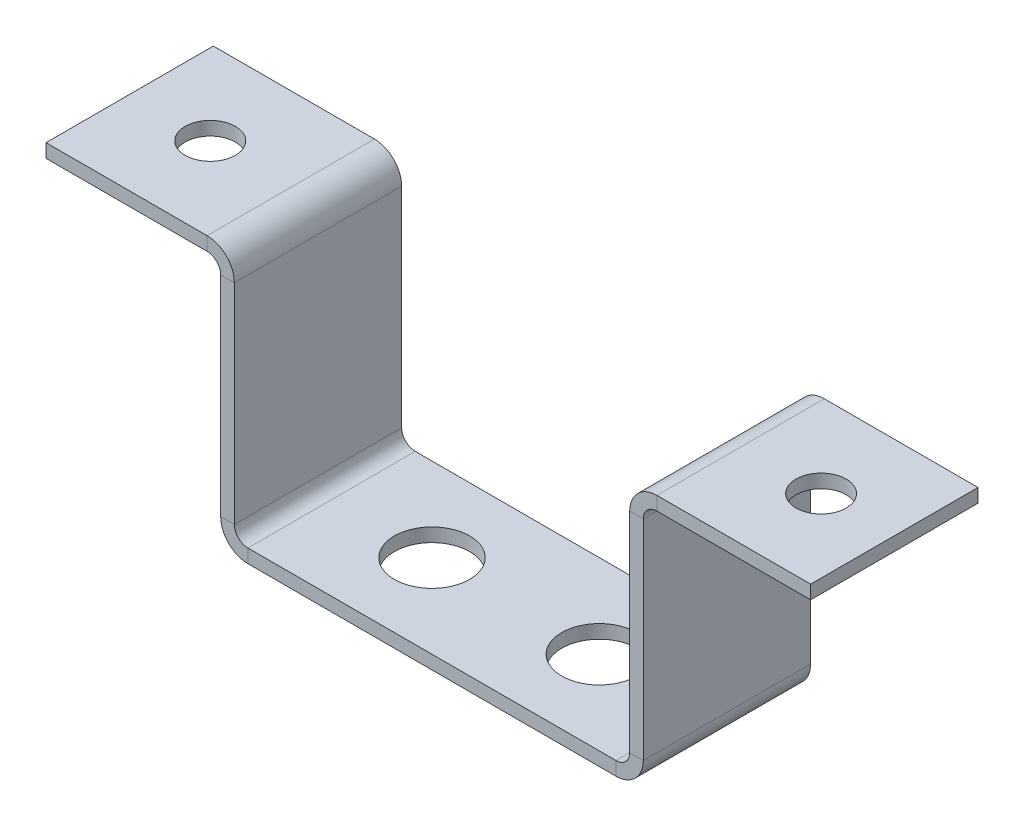
ISO-10303-21;
HEADER;
FILE_DESCRIPTION(('STEP AP214'),'2;1');
FILE_NAME('part.step','',(''),(''),'','','');
FILE_SCHEMA(('AUTOMOTIVE_DESIGN { 1 0 10303 214 1 1 1 1 }'));
ENDSEC;
DATA;
#1=APPLICATION_CONTEXT('core data for automotive mechanical design processes');
#2=APPLICATION_PROTOCOL_DEFINITION('international standard','automotive_design',2000,#1);
#3=PRODUCT_CONTEXT('',#1,'mechanical');
#4=PRODUCT('Part','Part','',(#3));
#5=PRODUCT_RELATED_PRODUCT_CATEGORY('part','',(#4));
#6=PRODUCT_DEFINITION_FORMATION('','',#4);
#7=PRODUCT_DEFINITION_CONTEXT('part definition',#1,'design');
#8=PRODUCT_DEFINITION('design','',#6,#7);
#9=PRODUCT_DEFINITION_SHAPE('','',#8);
#10=(LENGTH_UNIT() NAMED_UNIT(*) SI_UNIT(.MILLI.,.METRE.));
#11=(NAMED_UNIT(*) PLANE_ANGLE_UNIT() SI_UNIT($,.RADIAN.));
#12=(NAMED_UNIT(*) SI_UNIT($,.STERADIAN.) SOLID_ANGLE_UNIT());
#13=UNCERTAINTY_MEASURE_WITH_UNIT(LENGTH_MEASURE(1.E-05),#10,'distance_accuracy_value','');
#14=(GEOMETRIC_REPRESENTATION_CONTEXT(3) GLOBAL_UNCERTAINTY_ASSIGNED_CONTEXT((#13)) GLOBAL_UNIT_ASSIGNED_CONTEXT((#10,
#11,#12)) REPRESENTATION_CONTEXT('',''));
#15=CARTESIAN_POINT('',(0.,0.,0.));
#16=DIRECTION('',(0.,0.,1.));
#17=DIRECTION('',(1.,0.,0.));
#18=AXIS2_PLACEMENT_3D('',#15,#16,#17);
#19=CARTESIAN_POINT('',(23.6256,0.812799999999997,0.));
#20=DIRECTION('',(0.,0.,-1.));
#21=DIRECTION('',(-1.,0.,0.));
#22=AXIS2_PLACEMENT_3D('',#19,#20,#21);
#23=PLANE('',#22);
#24=DIRECTION('',(-1.,0.,0.));
#25=VECTOR('',#24,1.);
#26=CARTESIAN_POINT('',(23.6256,14.13,0.));
#27=LINE('',#26,#25);
#28=CARTESIAN_POINT('',(23.6256,14.13,0.));
#29=VERTEX_POINT('',#28);
#30=CARTESIAN_POINT('',(22.8128,14.13,0.));
#31=VERTEX_POINT('',#30);
#32=EDGE_CURVE('E289',#29,#31,#27,.T.);
#33=ORIENTED_EDGE('',*,*,#32,.T.);
#34=DIRECTION('',(0.,1.,0.));
#35=VECTOR('',#34,1.);
#36=CARTESIAN_POINT('',(22.8128,0.8128,0.));
#37=LINE('',#36,#35);
#38=CARTESIAN_POINT('',(22.8128,1.62559999999999,0.));
#39=VERTEX_POINT('',#38);
#40=EDGE_CURVE('E387',#31,#39,#37,.F.);
#41=ORIENTED_EDGE('',*,*,#40,.T.);
#42=DIRECTION('',(-1.,0.,0.));
#43=VECTOR('',#42,1.);
#44=CARTESIAN_POINT('',(23.6256,1.62559999999999,0.));
#45=LINE('',#44,#43);
#46=CARTESIAN_POINT('',(23.6256,1.62559999999999,0.));
#47=VERTEX_POINT('',#46);
#48=EDGE_CURVE('E371',#39,#47,#45,.F.);
#49=ORIENTED_EDGE('',*,*,#48,.T.);
#50=DIRECTION('',(0.,-1.,0.));
#51=VECTOR('',#50,1.);
#52=CARTESIAN_POINT('',(23.6256,0.,0.));
#53=LINE('',#52,#51);
#54=EDGE_CURVE('E380',#29,#47,#53,.T.);
#55=ORIENTED_EDGE('',*,*,#54,.F.);
#56=EDGE_LOOP('',(#33,#41,#49,#55));
#57=FACE_BOUND('',#56,.T.);
#58=ADVANCED_FACE('F87',(#57),#23,.F.);
#59=CARTESIAN_POINT('',(23.6256,14.9428,-10.));
#60=DIRECTION('',(0.,0.,1.));
#61=DIRECTION('',(0.,-1.,0.));
#62=AXIS2_PLACEMENT_3D('',#59,#60,#61);
#63=PLANE('',#62);
#64=DIRECTION('',(-1.,0.,0.));
#65=VECTOR('',#64,1.);
#66=CARTESIAN_POINT('',(23.6256,14.13,-10.));
#67=LINE('',#66,#65);
#68=CARTESIAN_POINT('',(23.6256,14.13,-10.));
#69=VERTEX_POINT('',#68);
#70=CARTESIAN_POINT('',(22.8128,14.13,-10.));
#71=VERTEX_POINT('',#70);
#72=EDGE_CURVE('E299',#69,#71,#67,.T.);
#73=ORIENTED_EDGE('',*,*,#72,.F.);
#74=DIRECTION('',(0.,1.,0.));
#75=VECTOR('',#74,1.);
#76=CARTESIAN_POINT('',(23.6256,0.,-10.));
#77=LINE('',#76,#75);
#78=CARTESIAN_POINT('',(23.6256,1.62559999999999,-10.));
#79=VERTEX_POINT('',#78);
#80=EDGE_CURVE('E375',#79,#69,#77,.T.);
#81=ORIENTED_EDGE('',*,*,#80,.F.);
#82=DIRECTION('',(-1.,0.,0.));
#83=VECTOR('',#82,1.);
#84=CARTESIAN_POINT('',(22.8128,1.62559999999999,-10.));
#85=LINE('',#84,#83);
#86=CARTESIAN_POINT('',(22.8128,1.62559999999999,-10.));
#87=VERTEX_POINT('',#86);
#88=EDGE_CURVE('E394',#87,#79,#85,.F.);
#89=ORIENTED_EDGE('',*,*,#88,.F.);
#90=DIRECTION('',(0.,-1.,0.));
#91=VECTOR('',#90,1.);
#92=CARTESIAN_POINT('',(22.8128,14.9428,-10.));
#93=LINE('',#92,#91);
#94=EDGE_CURVE('E383',#87,#71,#93,.F.);
#95=ORIENTED_EDGE('',*,*,#94,.T.);
#96=EDGE_LOOP('',(#73,#81,#89,#95));
#97=FACE_BOUND('',#96,.T.);
#98=ADVANCED_FACE('F518',(#97),#63,.F.);
#99=CARTESIAN_POINT('',(23.6256,0.,0.));
#100=DIRECTION('',(-1.,0.,0.));
#101=DIRECTION('',(0.,-1.,0.));
#102=AXIS2_PLACEMENT_3D('',#99,#100,#101);
#103=PLANE('',#102);
#104=DIRECTION('',(0.,0.,1.));
#105=VECTOR('',#104,1.);
#106=CARTESIAN_POINT('',(23.6256,14.13,0.));
#107=LINE('',#106,#105);
#108=EDGE_CURVE('E294',#29,#69,#107,.F.);
#109=ORIENTED_EDGE('',*,*,#108,.F.);
#110=ORIENTED_EDGE('',*,*,#54,.T.);
#111=DIRECTION('',(0.,0.,-1.));
#112=VECTOR('',#111,1.);
#113=CARTESIAN_POINT('',(23.6256,1.62559999999999,0.));
#114=LINE('',#113,#112);
#115=EDGE_CURVE('E390',#79,#47,#114,.F.);
#116=ORIENTED_EDGE('',*,*,#115,.F.);
#117=ORIENTED_EDGE('',*,*,#80,.T.);
#118=EDGE_LOOP('',(#109,#110,#116,#117));
#119=FACE_BOUND('',#118,.T.);
#120=ADVANCED_FACE('F513',(#119),#103,.F.);
#121=CARTESIAN_POINT('',(22.8128,0.,0.));
#122=DIRECTION('',(-1.,0.,0.));
#123=DIRECTION('',(0.,-1.,0.));
#124=AXIS2_PLACEMENT_3D('',#121,#122,#123);
#125=PLANE('',#124);
#126=ORIENTED_EDGE('',*,*,#40,.F.);
#127=DIRECTION('',(0.,0.,1.));
#128=VECTOR('',#127,1.);
#129=CARTESIAN_POINT('',(22.8128,14.13,0.));
#130=LINE('',#129,#128);
#131=EDGE_CURVE('E230',#31,#71,#130,.F.);
#132=ORIENTED_EDGE('',*,*,#131,.T.);
#133=ORIENTED_EDGE('',*,*,#94,.F.);
#134=DIRECTION('',(0.,0.,-1.));
#135=VECTOR('',#134,1.);
#136=CARTESIAN_POINT('',(22.8128,1.62559999999999,0.));
#137=LINE('',#136,#135);
#138=EDGE_CURVE('E398',#39,#87,#137,.T.);
#139=ORIENTED_EDGE('',*,*,#138,.F.);
#140=EDGE_LOOP('',(#126,#132,#133,#139));
#141=FACE_BOUND('',#140,.T.);
#142=ADVANCED_FACE('F526',(#141),#125,.T.);
#143=CARTESIAN_POINT('',(-1.62560000000005,14.9428,0.));
#144=DIRECTION('',(0.,0.,-1.));
#145=DIRECTION('',(0.,1.,0.));
#146=AXIS2_PLACEMENT_3D('',#143,#144,#145);
#147=PLANE('',#146);
#148=DIRECTION('',(1.,0.,0.));
#149=VECTOR('',#148,1.);
#150=CARTESIAN_POINT('',(-1.62560000000004,14.13,0.));
#151=LINE('',#150,#149);
#152=CARTESIAN_POINT('',(-1.62560000000004,14.13,0.));
#153=VERTEX_POINT('',#152);
#154=CARTESIAN_POINT('',(-0.812800000000044,14.13,0.));
#155=VERTEX_POINT('',#154);
#156=EDGE_CURVE('E368',#153,#155,#151,.T.);
#157=ORIENTED_EDGE('',*,*,#156,.F.);
#158=DIRECTION('',(0.,1.,0.));
#159=VECTOR('',#158,1.);
#160=CARTESIAN_POINT('',(-1.62559999999999,0.,0.));
#161=LINE('',#160,#159);
#162=CARTESIAN_POINT('',(-1.6256,1.62559999999999,0.));
#163=VERTEX_POINT('',#162);
#164=EDGE_CURVE('E424',#163,#153,#161,.T.);
#165=ORIENTED_EDGE('',*,*,#164,.F.);
#166=DIRECTION('',(1.,0.,0.));
#167=VECTOR('',#166,1.);
#168=CARTESIAN_POINT('',(-0.8128,1.6256,0.));
#169=LINE('',#168,#167);
#170=CARTESIAN_POINT('',(-0.812799999999999,1.6256,0.));
#171=VERTEX_POINT('',#170);
#172=EDGE_CURVE('E439',#171,#163,#169,.F.);
#173=ORIENTED_EDGE('',*,*,#172,.F.);
#174=DIRECTION('',(0.,-1.,0.));
#175=VECTOR('',#174,1.);
#176=CARTESIAN_POINT('',(-0.812800000000046,14.9428,0.));
#177=LINE('',#176,#175);
#178=EDGE_CURVE('E431',#171,#155,#177,.F.);
#179=ORIENTED_EDGE('',*,*,#178,.T.);
#180=EDGE_LOOP('',(#157,#165,#173,#179));
#181=FACE_BOUND('',#180,.T.);
#182=ADVANCED_FACE('F583',(#181),#147,.F.);
#183=CARTESIAN_POINT('',(-1.6256,0.812799999999997,-10.));
#184=DIRECTION('',(0.,0.,1.));
#185=DIRECTION('',(1.,0.,0.));
#186=AXIS2_PLACEMENT_3D('',#183,#184,#185);
#187=PLANE('',#186);
#188=DIRECTION('',(1.,0.,0.));
#189=VECTOR('',#188,1.);
#190=CARTESIAN_POINT('',(-1.62560000000004,14.13,-10.));
#191=LINE('',#190,#189);
#192=CARTESIAN_POINT('',(-1.62560000000004,14.13,-10.));
#193=VERTEX_POINT('',#192);
#194=CARTESIAN_POINT('',(-0.812800000000045,14.13,-10.));
#195=VERTEX_POINT('',#194);
#196=EDGE_CURVE('E354',#193,#195,#191,.T.);
#197=ORIENTED_EDGE('',*,*,#196,.T.);
#198=DIRECTION('',(0.,1.,0.));
#199=VECTOR('',#198,1.);
#200=CARTESIAN_POINT('',(-0.812799999999997,0.8128,-10.));
#201=LINE('',#200,#199);
#202=CARTESIAN_POINT('',(-0.8128,1.6256,-10.));
#203=VERTEX_POINT('',#202);
#204=EDGE_CURVE('E428',#195,#203,#201,.F.);
#205=ORIENTED_EDGE('',*,*,#204,.T.);
#206=DIRECTION('',(1.,0.,0.));
#207=VECTOR('',#206,1.);
#208=CARTESIAN_POINT('',(-1.6256,1.62559999999999,-10.));
#209=LINE('',#208,#207);
#210=CARTESIAN_POINT('',(-1.6256,1.62559999999999,-10.));
#211=VERTEX_POINT('',#210);
#212=EDGE_CURVE('E408',#203,#211,#209,.F.);
#213=ORIENTED_EDGE('',*,*,#212,.T.);
#214=DIRECTION('',(0.,-1.,0.));
#215=VECTOR('',#214,1.);
#216=CARTESIAN_POINT('',(-1.62559999999999,0.,-10.));
#217=LINE('',#216,#215);
#218=EDGE_CURVE('E420',#193,#211,#217,.T.);
#219=ORIENTED_EDGE('',*,*,#218,.F.);
#220=EDGE_LOOP('',(#197,#205,#213,#219));
#221=FACE_BOUND('',#220,.T.);
#222=ADVANCED_FACE('F587',(#221),#187,.F.);
#223=CARTESIAN_POINT('',(-1.62559999999999,0.,0.));
#224=DIRECTION('',(1.,0.,0.));
#225=DIRECTION('',(0.,1.,0.));
#226=AXIS2_PLACEMENT_3D('',#223,#224,#225);
#227=PLANE('',#226);
#228=DIRECTION('',(0.,0.,-1.));
#229=VECTOR('',#228,1.);
#230=CARTESIAN_POINT('',(-1.62560000000004,14.13,-10.));
#231=LINE('',#230,#229);
#232=EDGE_CURVE('E362',#193,#153,#231,.F.);
#233=ORIENTED_EDGE('',*,*,#232,.F.);
#234=ORIENTED_EDGE('',*,*,#218,.T.);
#235=DIRECTION('',(0.,0.,1.));
#236=VECTOR('',#235,1.);
#237=CARTESIAN_POINT('',(-1.6256,1.62559999999999,-10.));
#238=LINE('',#237,#236);
#239=EDGE_CURVE('E435',#163,#211,#238,.F.);
#240=ORIENTED_EDGE('',*,*,#239,.F.);
#241=ORIENTED_EDGE('',*,*,#164,.T.);
#242=EDGE_LOOP('',(#233,#234,#240,#241));
#243=FACE_BOUND('',#242,.T.);
#244=ADVANCED_FACE('F593',(#243),#227,.F.);
#245=CARTESIAN_POINT('',(-0.812799999999994,0.,0.));
#246=DIRECTION('',(1.,0.,0.));
#247=DIRECTION('',(0.,1.,0.));
#248=AXIS2_PLACEMENT_3D('',#245,#246,#247);
#249=PLANE('',#248);
#250=ORIENTED_EDGE('',*,*,#204,.F.);
#251=DIRECTION('',(0.,0.,-1.));
#252=VECTOR('',#251,1.);
#253=CARTESIAN_POINT('',(-0.812800000000045,14.13,-10.));
#254=LINE('',#253,#252);
#255=EDGE_CURVE('E347',#195,#155,#254,.F.);
#256=ORIENTED_EDGE('',*,*,#255,.T.);
#257=ORIENTED_EDGE('',*,*,#178,.F.);
#258=DIRECTION('',(0.,0.,1.));
#259=VECTOR('',#258,1.);
#260=CARTESIAN_POINT('',(-0.8128,1.6256,-10.));
#261=LINE('',#260,#259);
#262=EDGE_CURVE('E443',#203,#171,#261,.T.);
#263=ORIENTED_EDGE('',*,*,#262,.F.);
#264=EDGE_LOOP('',(#250,#256,#257,#263));
#265=FACE_BOUND('',#264,.T.);
#266=ADVANCED_FACE('F622',(#265),#249,.T.);
#267=CARTESIAN_POINT('',(0.,0.,0.));
#268=DIRECTION('',(0.,0.,-1.));
#269=DIRECTION('',(1.,0.,0.));
#270=AXIS2_PLACEMENT_3D('',#267,#268,#269);
#271=PLANE('',#270);
#272=DIRECTION('',(0.,-1.,0.));
#273=VECTOR('',#272,1.);
#274=CARTESIAN_POINT('',(22.,0.,0.));
#275=LINE('',#274,#273);
#276=CARTESIAN_POINT('',(22.,0.8128,0.));
#277=VERTEX_POINT('',#276);
#278=CARTESIAN_POINT('',(22.,0.,0.));
#279=VERTEX_POINT('',#278);
#280=EDGE_CURVE('E97',#277,#279,#275,.T.);
#281=ORIENTED_EDGE('',*,*,#280,.F.);
#282=DIRECTION('',(1.,0.,0.));
#283=VECTOR('',#282,1.);
#284=CARTESIAN_POINT('',(0.,0.8128,0.));
#285=LINE('',#284,#283);
#286=CARTESIAN_POINT('',(0.,0.8128,0.));
#287=VERTEX_POINT('',#286);
#288=EDGE_CURVE('E470',#287,#277,#285,.T.);
#289=ORIENTED_EDGE('',*,*,#288,.F.);
#290=DIRECTION('',(0.,-1.,0.));
#291=VECTOR('',#290,1.);
#292=CARTESIAN_POINT('',(0.,0.,0.));
#293=LINE('',#292,#291);
#294=CARTESIAN_POINT('',(0.,0.,0.));
#295=VERTEX_POINT('',#294);
#296=EDGE_CURVE('E494',#287,#295,#293,.T.);
#297=ORIENTED_EDGE('',*,*,#296,.T.);
#298=DIRECTION('',(1.,0.,0.));
#299=VECTOR('',#298,1.);
#300=CARTESIAN_POINT('',(0.,0.,0.));
#301=LINE('',#300,#299);
#302=EDGE_CURVE('E478',#295,#279,#301,.T.);
#303=ORIENTED_EDGE('',*,*,#302,.T.);
#304=EDGE_LOOP('',(#281,#289,#297,#303));
#305=FACE_BOUND('',#304,.T.);
#306=ADVANCED_FACE('F620',(#305),#271,.F.);
#307=CARTESIAN_POINT('',(0.,0.,-10.));
#308=DIRECTION('',(0.,0.,1.));
#309=DIRECTION('',(-1.,0.,0.));
#310=AXIS2_PLACEMENT_3D('',#307,#308,#309);
#311=PLANE('',#310);
#312=DIRECTION('',(1.,0.,0.));
#313=VECTOR('',#312,1.);
#314=CARTESIAN_POINT('',(0.,0.8128,-10.));
#315=LINE('',#314,#313);
#316=CARTESIAN_POINT('',(22.,0.8128,-10.));
#317=VERTEX_POINT('',#316);
#318=CARTESIAN_POINT('',(0.,0.8128,-10.));
#319=VERTEX_POINT('',#318);
#320=EDGE_CURVE('E484',#317,#319,#315,.F.);
#321=ORIENTED_EDGE('',*,*,#320,.F.);
#322=DIRECTION('',(0.,-1.,0.));
#323=VECTOR('',#322,1.);
#324=CARTESIAN_POINT('',(22.,0.,-10.));
#325=LINE('',#324,#323);
#326=CARTESIAN_POINT('',(22.,0.,-10.));
#327=VERTEX_POINT('',#326);
#328=EDGE_CURVE('E13',#317,#327,#325,.T.);
#329=ORIENTED_EDGE('',*,*,#328,.T.);
#330=DIRECTION('',(-1.,0.,0.));
#331=VECTOR('',#330,1.);
#332=CARTESIAN_POINT('',(0.,0.,-10.));
#333=LINE('',#332,#331);
#334=CARTESIAN_POINT('',(0.,0.,-10.));
#335=VERTEX_POINT('',#334);
#336=EDGE_CURVE('E469',#327,#335,#333,.T.);
#337=ORIENTED_EDGE('',*,*,#336,.T.);
#338=DIRECTION('',(0.,-1.,0.));
#339=VECTOR('',#338,1.);
#340=CARTESIAN_POINT('',(0.,0.,-10.));
#341=LINE('',#340,#339);
#342=EDGE_CURVE('E91',#319,#335,#341,.T.);
#343=ORIENTED_EDGE('',*,*,#342,.F.);
#344=EDGE_LOOP('',(#321,#329,#337,#343));
#345=FACE_BOUND('',#344,.T.);
#346=ADVANCED_FACE('F89',(#345),#311,.F.);
#347=CARTESIAN_POINT('',(0.,0.,0.));
#348=DIRECTION('',(0.,-1.,0.));
#349=DIRECTION('',(0.,0.,-1.));
#350=AXIS2_PLACEMENT_3D('',#347,#348,#349);
#351=PLANE('',#350);
#352=CARTESIAN_POINT('',(6.,0.,-5.));
#353=DIRECTION('',(0.,-1.,0.));
#354=DIRECTION('',(0.,0.,-1.));
#355=AXIS2_PLACEMENT_3D('',#352,#353,#354);
#356=CIRCLE('',#355,2.25);
#357=CARTESIAN_POINT('',(6.,0.,-7.25));
#358=VERTEX_POINT('',#357);
#359=EDGE_CURVE('E732',#358,#358,#356,.T.);
#360=ORIENTED_EDGE('',*,*,#359,.F.);
#361=EDGE_LOOP('',(#360));
#362=FACE_BOUND('',#361,.T.);
#363=CARTESIAN_POINT('',(16.,0.,-5.));
#364=DIRECTION('',(0.,-1.,0.));
#365=DIRECTION('',(0.,0.,-1.));
#366=AXIS2_PLACEMENT_3D('',#363,#364,#365);
#367=CIRCLE('',#366,2.25);
#368=CARTESIAN_POINT('',(16.,0.,-7.25));
#369=VERTEX_POINT('',#368);
#370=EDGE_CURVE('E744',#369,#369,#367,.T.);
#371=ORIENTED_EDGE('',*,*,#370,.F.);
#372=EDGE_LOOP('',(#371));
#373=FACE_BOUND('',#372,.T.);
#374=DIRECTION('',(0.,0.,1.));
#375=VECTOR('',#374,1.);
#376=CARTESIAN_POINT('',(0.,0.,0.));
#377=LINE('',#376,#375);
#378=EDGE_CURVE('E465',#335,#295,#377,.T.);
#379=ORIENTED_EDGE('',*,*,#378,.F.);
#380=ORIENTED_EDGE('',*,*,#336,.F.);
#381=DIRECTION('',(0.,0.,-1.));
#382=VECTOR('',#381,1.);
#383=CARTESIAN_POINT('',(22.,0.,0.));
#384=LINE('',#383,#382);
#385=EDGE_CURVE('E474',#279,#327,#384,.T.);
#386=ORIENTED_EDGE('',*,*,#385,.F.);
#387=ORIENTED_EDGE('',*,*,#302,.F.);
#388=EDGE_LOOP('',(#379,#380,#386,#387));
#389=FACE_BOUND('',#388,.T.);
#390=ADVANCED_FACE('F614',(#362,#373,#389),#351,.T.);
#391=CARTESIAN_POINT('',(0.,0.8128,0.));
#392=DIRECTION('',(0.,-1.,0.));
#393=DIRECTION('',(0.,0.,-1.));
#394=AXIS2_PLACEMENT_3D('',#391,#392,#393);
#395=PLANE('',#394);
#396=CARTESIAN_POINT('',(6.,0.812800000000001,-5.));
#397=DIRECTION('',(0.,-1.,0.));
#398=DIRECTION('',(0.,0.,-1.));
#399=AXIS2_PLACEMENT_3D('',#396,#397,#398);
#400=CIRCLE('',#399,2.25);
#401=CARTESIAN_POINT('',(6.,0.812800000000001,-7.25));
#402=VERTEX_POINT('',#401);
#403=EDGE_CURVE('E735',#402,#402,#400,.F.);
#404=ORIENTED_EDGE('',*,*,#403,.F.);
#405=EDGE_LOOP('',(#404));
#406=FACE_BOUND('',#405,.T.);
#407=CARTESIAN_POINT('',(16.,0.812800000000001,-5.));
#408=DIRECTION('',(0.,-1.,0.));
#409=DIRECTION('',(0.,0.,-1.));
#410=AXIS2_PLACEMENT_3D('',#407,#408,#409);
#411=CIRCLE('',#410,2.25);
#412=CARTESIAN_POINT('',(16.,0.812800000000001,-7.25));
#413=VERTEX_POINT('',#412);
#414=EDGE_CURVE('E747',#413,#413,#411,.F.);
#415=ORIENTED_EDGE('',*,*,#414,.F.);
#416=EDGE_LOOP('',(#415));
#417=FACE_BOUND('',#416,.T.);
#418=DIRECTION('',(0.,0.,-1.));
#419=VECTOR('',#418,1.);
#420=CARTESIAN_POINT('',(0.,0.8128,0.));
#421=LINE('',#420,#419);
#422=EDGE_CURVE('E453',#319,#287,#421,.F.);
#423=ORIENTED_EDGE('',*,*,#422,.T.);
#424=ORIENTED_EDGE('',*,*,#288,.T.);
#425=DIRECTION('',(0.,0.,-1.));
#426=VECTOR('',#425,1.);
#427=CARTESIAN_POINT('',(22.,0.8128,0.));
#428=LINE('',#427,#426);
#429=EDGE_CURVE('E488',#277,#317,#428,.T.);
#430=ORIENTED_EDGE('',*,*,#429,.T.);
#431=ORIENTED_EDGE('',*,*,#320,.T.);
#432=EDGE_LOOP('',(#423,#424,#430,#431));
#433=FACE_BOUND('',#432,.T.);
#434=ADVANCED_FACE('F535',(#406,#417,#433),#395,.F.);
#435=CARTESIAN_POINT('',(0.,1.6256,-10.));
#436=DIRECTION('',(0.,0.,-1.));
#437=DIRECTION('',(-1.,0.,0.));
#438=AXIS2_PLACEMENT_3D('',#435,#436,#437);
#439=PLANE('',#438);
#440=ORIENTED_EDGE('',*,*,#212,.F.);
#441=CARTESIAN_POINT('',(0.,1.6256,-10.));
#442=DIRECTION('',(0.,0.,1.));
#443=DIRECTION('',(1.,0.,0.));
#444=AXIS2_PLACEMENT_3D('',#441,#442,#443);
#445=CIRCLE('',#444,0.8128);
#446=EDGE_CURVE('E458',#319,#203,#445,.F.);
#447=ORIENTED_EDGE('',*,*,#446,.F.);
#448=ORIENTED_EDGE('',*,*,#342,.T.);
#449=CARTESIAN_POINT('',(0.,1.6256,-10.));
#450=DIRECTION('',(0.,0.,1.));
#451=DIRECTION('',(1.,0.,0.));
#452=AXIS2_PLACEMENT_3D('',#449,#450,#451);
#453=CIRCLE('',#452,1.6256);
#454=EDGE_CURVE('E449',#335,#211,#453,.F.);
#455=ORIENTED_EDGE('',*,*,#454,.T.);
#456=EDGE_LOOP('',(#440,#447,#448,#455));
#457=FACE_BOUND('',#456,.T.);
#458=ADVANCED_FACE('F607',(#457),#439,.T.);
#459=CARTESIAN_POINT('',(0.,1.6256,0.));
#460=DIRECTION('',(0.,0.,-1.));
#461=DIRECTION('',(-1.,0.,0.));
#462=AXIS2_PLACEMENT_3D('',#459,#460,#461);
#463=PLANE('',#462);
#464=CARTESIAN_POINT('',(0.,1.6256,0.));
#465=DIRECTION('',(0.,0.,1.));
#466=DIRECTION('',(1.,0.,0.));
#467=AXIS2_PLACEMENT_3D('',#464,#465,#466);
#468=CIRCLE('',#467,0.8128);
#469=EDGE_CURVE('E423',#171,#287,#468,.T.);
#470=ORIENTED_EDGE('',*,*,#469,.F.);
#471=ORIENTED_EDGE('',*,*,#172,.T.);
#472=CARTESIAN_POINT('',(0.,1.6256,0.));
#473=DIRECTION('',(0.,0.,1.));
#474=DIRECTION('',(1.,0.,0.));
#475=AXIS2_PLACEMENT_3D('',#472,#473,#474);
#476=CIRCLE('',#475,1.6256);
#477=EDGE_CURVE('E454',#163,#295,#476,.T.);
#478=ORIENTED_EDGE('',*,*,#477,.T.);
#479=ORIENTED_EDGE('',*,*,#296,.F.);
#480=EDGE_LOOP('',(#470,#471,#478,#479));
#481=FACE_BOUND('',#480,.T.);
#482=ADVANCED_FACE('F602',(#481),#463,.F.);
#483=CARTESIAN_POINT('',(0.,1.6256,0.));
#484=DIRECTION('',(0.,0.,1.));
#485=DIRECTION('',(-1.,0.,0.));
#486=AXIS2_PLACEMENT_3D('',#483,#484,#485);
#487=CYLINDRICAL_SURFACE('',#486,1.6256);
#488=ORIENTED_EDGE('',*,*,#378,.T.);
#489=ORIENTED_EDGE('',*,*,#477,.F.);
#490=ORIENTED_EDGE('',*,*,#239,.T.);
#491=ORIENTED_EDGE('',*,*,#454,.F.);
#492=EDGE_LOOP('',(#488,#489,#490,#491));
#493=FACE_BOUND('',#492,.T.);
#494=ADVANCED_FACE('F599',(#493),#487,.T.);
#495=CARTESIAN_POINT('',(0.,1.6256,0.));
#496=DIRECTION('',(0.,0.,1.));
#497=DIRECTION('',(-1.,0.,0.));
#498=AXIS2_PLACEMENT_3D('',#495,#496,#497);
#499=CYLINDRICAL_SURFACE('',#498,0.8128);
#500=ORIENTED_EDGE('',*,*,#422,.F.);
#501=ORIENTED_EDGE('',*,*,#446,.T.);
#502=ORIENTED_EDGE('',*,*,#262,.T.);
#503=ORIENTED_EDGE('',*,*,#469,.T.);
#504=EDGE_LOOP('',(#500,#501,#502,#503));
#505=FACE_BOUND('',#504,.T.);
#506=ADVANCED_FACE('F549',(#505),#499,.F.);
#507=CARTESIAN_POINT('',(22.,1.6256,0.));
#508=DIRECTION('',(0.,0.,1.));
#509=DIRECTION('',(1.,0.,0.));
#510=AXIS2_PLACEMENT_3D('',#507,#508,#509);
#511=PLANE('',#510);
#512=ORIENTED_EDGE('',*,*,#48,.F.);
#513=CARTESIAN_POINT('',(22.,1.6256,0.));
#514=DIRECTION('',(0.,0.,-1.));
#515=DIRECTION('',(-1.,0.,0.));
#516=AXIS2_PLACEMENT_3D('',#513,#514,#515);
#517=CIRCLE('',#516,0.812799999999999);
#518=EDGE_CURVE('E413',#277,#39,#517,.F.);
#519=ORIENTED_EDGE('',*,*,#518,.F.);
#520=ORIENTED_EDGE('',*,*,#280,.T.);
#521=CARTESIAN_POINT('',(22.,1.6256,0.));
#522=DIRECTION('',(0.,0.,-1.));
#523=DIRECTION('',(-1.,0.,0.));
#524=AXIS2_PLACEMENT_3D('',#521,#522,#523);
#525=CIRCLE('',#524,1.6256);
#526=EDGE_CURVE('E404',#279,#47,#525,.F.);
#527=ORIENTED_EDGE('',*,*,#526,.T.);
#528=EDGE_LOOP('',(#512,#519,#520,#527));
#529=FACE_BOUND('',#528,.T.);
#530=ADVANCED_FACE('F504',(#529),#511,.T.);
#531=CARTESIAN_POINT('',(22.,1.6256,-10.));
#532=DIRECTION('',(0.,0.,1.));
#533=DIRECTION('',(1.,0.,0.));
#534=AXIS2_PLACEMENT_3D('',#531,#532,#533);
#535=PLANE('',#534);
#536=CARTESIAN_POINT('',(22.,1.6256,-10.));
#537=DIRECTION('',(0.,0.,-1.));
#538=DIRECTION('',(-1.,0.,0.));
#539=AXIS2_PLACEMENT_3D('',#536,#537,#538);
#540=CIRCLE('',#539,0.812799999999999);
#541=EDGE_CURVE('E379',#87,#317,#540,.T.);
#542=ORIENTED_EDGE('',*,*,#541,.F.);
#543=ORIENTED_EDGE('',*,*,#88,.T.);
#544=CARTESIAN_POINT('',(22.,1.6256,-10.));
#545=DIRECTION('',(0.,0.,-1.));
#546=DIRECTION('',(-1.,0.,0.));
#547=AXIS2_PLACEMENT_3D('',#544,#545,#546);
#548=CIRCLE('',#547,1.6256);
#549=EDGE_CURVE('E409',#79,#327,#548,.T.);
#550=ORIENTED_EDGE('',*,*,#549,.T.);
#551=ORIENTED_EDGE('',*,*,#328,.F.);
#552=EDGE_LOOP('',(#542,#543,#550,#551));
#553=FACE_BOUND('',#552,.T.);
#554=ADVANCED_FACE('F541',(#553),#535,.F.);
#555=CARTESIAN_POINT('',(22.,1.6256,-10.));
#556=DIRECTION('',(0.,0.,-1.));
#557=DIRECTION('',(1.,0.,0.));
#558=AXIS2_PLACEMENT_3D('',#555,#556,#557);
#559=CYLINDRICAL_SURFACE('',#558,1.6256);
#560=ORIENTED_EDGE('',*,*,#385,.T.);
#561=ORIENTED_EDGE('',*,*,#549,.F.);
#562=ORIENTED_EDGE('',*,*,#115,.T.);
#563=ORIENTED_EDGE('',*,*,#526,.F.);
#564=EDGE_LOOP('',(#560,#561,#562,#563));
#565=FACE_BOUND('',#564,.T.);
#566=ADVANCED_FACE('F508',(#565),#559,.T.);
#567=CARTESIAN_POINT('',(22.,1.6256,-10.));
#568=DIRECTION('',(0.,0.,-1.));
#569=DIRECTION('',(1.,0.,0.));
#570=AXIS2_PLACEMENT_3D('',#567,#568,#569);
#571=CYLINDRICAL_SURFACE('',#570,0.812799999999999);
#572=ORIENTED_EDGE('',*,*,#429,.F.);
#573=ORIENTED_EDGE('',*,*,#518,.T.);
#574=ORIENTED_EDGE('',*,*,#138,.T.);
#575=ORIENTED_EDGE('',*,*,#541,.T.);
#576=EDGE_LOOP('',(#572,#573,#574,#575));
#577=FACE_BOUND('',#576,.T.);
#578=ADVANCED_FACE('F531',(#577),#571,.F.);
#579=CARTESIAN_POINT('',(-2.43840000000005,14.13,0.));
#580=DIRECTION('',(0.,0.,1.));
#581=DIRECTION('',(1.,0.,0.));
#582=AXIS2_PLACEMENT_3D('',#579,#580,#581);
#583=PLANE('',#582);
#584=DIRECTION('',(0.,1.,0.));
#585=VECTOR('',#584,1.);
#586=CARTESIAN_POINT('',(-2.43840000000005,14.9428,0.));
#587=LINE('',#586,#585);
#588=CARTESIAN_POINT('',(-2.43840000000005,14.9428,0.));
#589=VERTEX_POINT('',#588);
#590=CARTESIAN_POINT('',(-2.43840000000005,15.7556,0.));
#591=VERTEX_POINT('',#590);
#592=EDGE_CURVE('E302',#589,#591,#587,.T.);
#593=ORIENTED_EDGE('',*,*,#592,.F.);
#594=CARTESIAN_POINT('',(-2.43840000000005,14.13,0.));
#595=DIRECTION('',(0.,0.,-1.));
#596=DIRECTION('',(-1.,0.,0.));
#597=AXIS2_PLACEMENT_3D('',#594,#595,#596);
#598=CIRCLE('',#597,0.812800000000001);
#599=EDGE_CURVE('E358',#153,#589,#598,.F.);
#600=ORIENTED_EDGE('',*,*,#599,.F.);
#601=ORIENTED_EDGE('',*,*,#156,.T.);
#602=CARTESIAN_POINT('',(-2.43840000000005,14.13,0.));
#603=DIRECTION('',(0.,0.,-1.));
#604=DIRECTION('',(-1.,0.,0.));
#605=AXIS2_PLACEMENT_3D('',#602,#603,#604);
#606=CIRCLE('',#605,1.6256);
#607=EDGE_CURVE('E112',#155,#591,#606,.F.);
#608=ORIENTED_EDGE('',*,*,#607,.T.);
#609=EDGE_LOOP('',(#593,#600,#601,#608));
#610=FACE_BOUND('',#609,.T.);
#611=ADVANCED_FACE('F562',(#610),#583,.T.);
#612=CARTESIAN_POINT('',(-2.43840000000005,14.13,-10.));
#613=DIRECTION('',(0.,0.,1.));
#614=DIRECTION('',(1.,0.,0.));
#615=AXIS2_PLACEMENT_3D('',#612,#613,#614);
#616=PLANE('',#615);
#617=CARTESIAN_POINT('',(-2.43840000000005,14.13,-10.));
#618=DIRECTION('',(0.,0.,-1.));
#619=DIRECTION('',(-1.,0.,0.));
#620=AXIS2_PLACEMENT_3D('',#617,#618,#619);
#621=CIRCLE('',#620,0.812800000000001);
#622=CARTESIAN_POINT('',(-2.43840000000005,14.9428,-10.));
#623=VERTEX_POINT('',#622);
#624=EDGE_CURVE('E346',#623,#193,#621,.T.);
#625=ORIENTED_EDGE('',*,*,#624,.F.);
#626=DIRECTION('',(0.,1.,0.));
#627=VECTOR('',#626,1.);
#628=CARTESIAN_POINT('',(-2.43840000000005,14.9428,-10.));
#629=LINE('',#628,#627);
#630=CARTESIAN_POINT('',(-2.43840000000005,15.7556,-10.));
#631=VERTEX_POINT('',#630);
#632=EDGE_CURVE('E308',#623,#631,#629,.T.);
#633=ORIENTED_EDGE('',*,*,#632,.T.);
#634=CARTESIAN_POINT('',(-2.43840000000005,14.13,-10.));
#635=DIRECTION('',(0.,0.,-1.));
#636=DIRECTION('',(-1.,0.,0.));
#637=AXIS2_PLACEMENT_3D('',#634,#635,#636);
#638=CIRCLE('',#637,1.6256);
#639=EDGE_CURVE('E351',#631,#195,#638,.T.);
#640=ORIENTED_EDGE('',*,*,#639,.T.);
#641=ORIENTED_EDGE('',*,*,#196,.F.);
#642=EDGE_LOOP('',(#625,#633,#640,#641));
#643=FACE_BOUND('',#642,.T.);
#644=ADVANCED_FACE('F567',(#643),#616,.F.);
#645=CARTESIAN_POINT('',(-2.43840000000005,14.13,-10.));
#646=DIRECTION('',(0.,0.,-1.));
#647=DIRECTION('',(0.,1.,0.));
#648=AXIS2_PLACEMENT_3D('',#645,#646,#647);
#649=CYLINDRICAL_SURFACE('',#648,1.6256);
#650=ORIENTED_EDGE('',*,*,#255,.F.);
#651=ORIENTED_EDGE('',*,*,#639,.F.);
#652=DIRECTION('',(0.,0.,1.));
#653=VECTOR('',#652,1.);
#654=CARTESIAN_POINT('',(-2.43840000000005,15.7556,0.));
#655=LINE('',#654,#653);
#656=EDGE_CURVE('E312',#631,#591,#655,.T.);
#657=ORIENTED_EDGE('',*,*,#656,.T.);
#658=ORIENTED_EDGE('',*,*,#607,.F.);
#659=EDGE_LOOP('',(#650,#651,#657,#658));
#660=FACE_BOUND('',#659,.T.);
#661=ADVANCED_FACE('F574',(#660),#649,.T.);
#662=CARTESIAN_POINT('',(-2.43840000000005,14.13,-10.));
#663=DIRECTION('',(0.,0.,-1.));
#664=DIRECTION('',(0.,1.,0.));
#665=AXIS2_PLACEMENT_3D('',#662,#663,#664);
#666=CYLINDRICAL_SURFACE('',#665,0.812800000000001);
#667=ORIENTED_EDGE('',*,*,#232,.T.);
#668=ORIENTED_EDGE('',*,*,#599,.T.);
#669=DIRECTION('',(0.,0.,-1.));
#670=VECTOR('',#669,1.);
#671=CARTESIAN_POINT('',(-2.43840000000005,14.9428,0.));
#672=LINE('',#671,#670);
#673=EDGE_CURVE('E305',#589,#623,#672,.T.);
#674=ORIENTED_EDGE('',*,*,#673,.T.);
#675=ORIENTED_EDGE('',*,*,#624,.T.);
#676=EDGE_LOOP('',(#667,#668,#674,#675));
#677=FACE_BOUND('',#676,.T.);
#678=ADVANCED_FACE('F578',(#677),#666,.F.);
#679=CARTESIAN_POINT('',(-1.62560000000005,15.7556,0.));
#680=DIRECTION('',(0.,0.,-1.));
#681=DIRECTION('',(-1.,0.,0.));
#682=AXIS2_PLACEMENT_3D('',#679,#680,#681);
#683=PLANE('',#682);
#684=ORIENTED_EDGE('',*,*,#592,.T.);
#685=DIRECTION('',(1.,0.,0.));
#686=VECTOR('',#685,1.);
#687=CARTESIAN_POINT('',(-1.62560000000005,15.7556,0.));
#688=LINE('',#687,#686);
#689=CARTESIAN_POINT('',(-12.064,15.7556,0.));
#690=VERTEX_POINT('',#689);
#691=EDGE_CURVE('E319',#690,#591,#688,.T.);
#692=ORIENTED_EDGE('',*,*,#691,.F.);
#693=DIRECTION('',(0.,-1.,0.));
#694=VECTOR('',#693,1.);
#695=CARTESIAN_POINT('',(-12.064,15.7556,0.));
#696=LINE('',#695,#694);
#697=CARTESIAN_POINT('',(-12.064,14.9428,0.));
#698=VERTEX_POINT('',#697);
#699=EDGE_CURVE('E330',#690,#698,#696,.T.);
#700=ORIENTED_EDGE('',*,*,#699,.T.);
#701=DIRECTION('',(1.,0.,0.));
#702=VECTOR('',#701,1.);
#703=CARTESIAN_POINT('',(-1.62560000000005,14.9428,0.));
#704=LINE('',#703,#702);
#705=EDGE_CURVE('E318',#698,#589,#704,.T.);
#706=ORIENTED_EDGE('',*,*,#705,.T.);
#707=EDGE_LOOP('',(#684,#692,#700,#706));
#708=FACE_BOUND('',#707,.T.);
#709=ADVANCED_FACE('F656',(#708),#683,.F.);
#710=CARTESIAN_POINT('',(-12.064,15.7556,-10.));
#711=DIRECTION('',(0.,0.,1.));
#712=DIRECTION('',(1.,0.,0.));
#713=AXIS2_PLACEMENT_3D('',#710,#711,#712);
#714=PLANE('',#713);
#715=ORIENTED_EDGE('',*,*,#632,.F.);
#716=DIRECTION('',(-1.,0.,0.));
#717=VECTOR('',#716,1.);
#718=CARTESIAN_POINT('',(-12.064,14.9428,-10.));
#719=LINE('',#718,#717);
#720=CARTESIAN_POINT('',(-12.064,14.9428,-10.));
#721=VERTEX_POINT('',#720);
#722=EDGE_CURVE('E334',#623,#721,#719,.T.);
#723=ORIENTED_EDGE('',*,*,#722,.T.);
#724=DIRECTION('',(0.,-1.,0.));
#725=VECTOR('',#724,1.);
#726=CARTESIAN_POINT('',(-12.064,15.7556,-10.));
#727=LINE('',#726,#725);
#728=CARTESIAN_POINT('',(-12.064,15.7556,-10.));
#729=VERTEX_POINT('',#728);
#730=EDGE_CURVE('E342',#729,#721,#727,.T.);
#731=ORIENTED_EDGE('',*,*,#730,.F.);
#732=DIRECTION('',(-1.,0.,0.));
#733=VECTOR('',#732,1.);
#734=CARTESIAN_POINT('',(-12.064,15.7556,-10.));
#735=LINE('',#734,#733);
#736=EDGE_CURVE('E323',#631,#729,#735,.T.);
#737=ORIENTED_EDGE('',*,*,#736,.F.);
#738=EDGE_LOOP('',(#715,#723,#731,#737));
#739=FACE_BOUND('',#738,.T.);
#740=ADVANCED_FACE('F666',(#739),#714,.F.);
#741=CARTESIAN_POINT('',(0.,15.7556,0.));
#742=DIRECTION('',(0.,-1.,0.));
#743=DIRECTION('',(0.,0.,-1.));
#744=AXIS2_PLACEMENT_3D('',#741,#742,#743);
#745=PLANE('',#744);
#746=CARTESIAN_POINT('',(-7.25120000000005,15.7556,-5.));
#747=DIRECTION('',(0.,1.,0.));
#748=DIRECTION('',(0.,0.,1.));
#749=AXIS2_PLACEMENT_3D('',#746,#747,#748);
#750=CIRCLE('',#749,1.5);
#751=CARTESIAN_POINT('',(-7.25120000000005,15.7556,-3.5));
#752=VERTEX_POINT('',#751);
#753=EDGE_CURVE('E754',#752,#752,#750,.T.);
#754=ORIENTED_EDGE('',*,*,#753,.F.);
#755=EDGE_LOOP('',(#754));
#756=FACE_BOUND('',#755,.T.);
#757=ORIENTED_EDGE('',*,*,#656,.F.);
#758=ORIENTED_EDGE('',*,*,#736,.T.);
#759=DIRECTION('',(0.,0.,1.));
#760=VECTOR('',#759,1.);
#761=CARTESIAN_POINT('',(-12.064,15.7556,0.));
#762=LINE('',#761,#760);
#763=EDGE_CURVE('E327',#729,#690,#762,.T.);
#764=ORIENTED_EDGE('',*,*,#763,.T.);
#765=ORIENTED_EDGE('',*,*,#691,.T.);
#766=EDGE_LOOP('',(#757,#758,#764,#765));
#767=FACE_BOUND('',#766,.T.);
#768=ADVANCED_FACE('F669',(#756,#767),#745,.F.);
#769=CARTESIAN_POINT('',(0.,14.9428,0.));
#770=DIRECTION('',(0.,-1.,0.));
#771=DIRECTION('',(0.,0.,-1.));
#772=AXIS2_PLACEMENT_3D('',#769,#770,#771);
#773=PLANE('',#772);
#774=CARTESIAN_POINT('',(-7.25120000000005,14.9428,-5.));
#775=DIRECTION('',(0.,-1.,0.));
#776=DIRECTION('',(0.,0.,-1.));
#777=AXIS2_PLACEMENT_3D('',#774,#775,#776);
#778=CIRCLE('',#777,1.5);
#779=CARTESIAN_POINT('',(-7.25120000000005,14.9428,-6.5));
#780=VERTEX_POINT('',#779);
#781=EDGE_CURVE('E759',#780,#780,#778,.F.);
#782=ORIENTED_EDGE('',*,*,#781,.T.);
#783=EDGE_LOOP('',(#782));
#784=FACE_BOUND('',#783,.T.);
#785=ORIENTED_EDGE('',*,*,#722,.F.);
#786=ORIENTED_EDGE('',*,*,#673,.F.);
#787=ORIENTED_EDGE('',*,*,#705,.F.);
#788=DIRECTION('',(0.,0.,1.));
#789=VECTOR('',#788,1.);
#790=CARTESIAN_POINT('',(-12.064,14.9428,0.));
#791=LINE('',#790,#789);
#792=EDGE_CURVE('E324',#721,#698,#791,.T.);
#793=ORIENTED_EDGE('',*,*,#792,.F.);
#794=EDGE_LOOP('',(#785,#786,#787,#793));
#795=FACE_BOUND('',#794,.T.);
#796=ADVANCED_FACE('F653',(#784,#795),#773,.T.);
#797=CARTESIAN_POINT('',(-12.064,15.7556,0.));
#798=DIRECTION('',(1.,0.,0.));
#799=DIRECTION('',(0.,0.,-1.));
#800=AXIS2_PLACEMENT_3D('',#797,#798,#799);
#801=PLANE('',#800);
#802=ORIENTED_EDGE('',*,*,#792,.T.);
#803=ORIENTED_EDGE('',*,*,#699,.F.);
#804=ORIENTED_EDGE('',*,*,#763,.F.);
#805=ORIENTED_EDGE('',*,*,#730,.T.);
#806=EDGE_LOOP('',(#802,#803,#804,#805));
#807=FACE_BOUND('',#806,.T.);
#808=ADVANCED_FACE('F661',(#807),#801,.F.);
#809=CARTESIAN_POINT('',(24.4384,14.13,-10.));
#810=DIRECTION('',(0.,0.,-1.));
#811=DIRECTION('',(-1.,0.,0.));
#812=AXIS2_PLACEMENT_3D('',#809,#810,#811);
#813=PLANE('',#812);
#814=DIRECTION('',(0.,1.,0.));
#815=VECTOR('',#814,1.);
#816=CARTESIAN_POINT('',(24.4384,14.9428,-10.));
#817=LINE('',#816,#815);
#818=CARTESIAN_POINT('',(24.4384,14.9428,-10.));
#819=VERTEX_POINT('',#818);
#820=CARTESIAN_POINT('',(24.4384,15.7556,-10.));
#821=VERTEX_POINT('',#820);
#822=EDGE_CURVE('E758',#819,#821,#817,.T.);
#823=ORIENTED_EDGE('',*,*,#822,.F.);
#824=CARTESIAN_POINT('',(24.4384,14.13,-10.));
#825=DIRECTION('',(0.,0.,1.));
#826=DIRECTION('',(1.,0.,0.));
#827=AXIS2_PLACEMENT_3D('',#824,#825,#826);
#828=CIRCLE('',#827,0.812800000000001);
#829=EDGE_CURVE('E234',#69,#819,#828,.F.);
#830=ORIENTED_EDGE('',*,*,#829,.F.);
#831=ORIENTED_EDGE('',*,*,#72,.T.);
#832=CARTESIAN_POINT('',(24.4384,14.13,-10.));
#833=DIRECTION('',(0.,0.,1.));
#834=DIRECTION('',(1.,0.,0.));
#835=AXIS2_PLACEMENT_3D('',#832,#833,#834);
#836=CIRCLE('',#835,1.6256);
#837=EDGE_CURVE('E104',#71,#821,#836,.F.);
#838=ORIENTED_EDGE('',*,*,#837,.T.);
#839=EDGE_LOOP('',(#823,#830,#831,#838));
#840=FACE_BOUND('',#839,.T.);
#841=ADVANCED_FACE('F522',(#840),#813,.T.);
#842=CARTESIAN_POINT('',(24.4384,14.13,0.));
#843=DIRECTION('',(0.,0.,-1.));
#844=DIRECTION('',(-1.,0.,0.));
#845=AXIS2_PLACEMENT_3D('',#842,#843,#844);
#846=PLANE('',#845);
#847=CARTESIAN_POINT('',(24.4384,14.13,0.));
#848=DIRECTION('',(0.,0.,1.));
#849=DIRECTION('',(1.,0.,0.));
#850=AXIS2_PLACEMENT_3D('',#847,#848,#849);
#851=CIRCLE('',#850,0.812800000000001);
#852=CARTESIAN_POINT('',(24.4384,14.9428,0.));
#853=VERTEX_POINT('',#852);
#854=EDGE_CURVE('E241',#853,#29,#851,.T.);
#855=ORIENTED_EDGE('',*,*,#854,.F.);
#856=DIRECTION('',(0.,1.,0.));
#857=VECTOR('',#856,1.);
#858=CARTESIAN_POINT('',(24.4384,14.9428,0.));
#859=LINE('',#858,#857);
#860=CARTESIAN_POINT('',(24.4384,15.7556,0.));
#861=VERTEX_POINT('',#860);
#862=EDGE_CURVE('E238',#853,#861,#859,.T.);
#863=ORIENTED_EDGE('',*,*,#862,.T.);
#864=CARTESIAN_POINT('',(24.4384,14.13,0.));
#865=DIRECTION('',(0.,0.,1.));
#866=DIRECTION('',(1.,0.,0.));
#867=AXIS2_PLACEMENT_3D('',#864,#865,#866);
#868=CIRCLE('',#867,1.6256);
#869=EDGE_CURVE('E224',#861,#31,#868,.T.);
#870=ORIENTED_EDGE('',*,*,#869,.T.);
#871=ORIENTED_EDGE('',*,*,#32,.F.);
#872=EDGE_LOOP('',(#855,#863,#870,#871));
#873=FACE_BOUND('',#872,.T.);
#874=ADVANCED_FACE('F239',(#873),#846,.F.);
#875=CARTESIAN_POINT('',(24.4384,14.13,0.));
#876=DIRECTION('',(0.,0.,1.));
#877=DIRECTION('',(0.,1.,0.));
#878=AXIS2_PLACEMENT_3D('',#875,#876,#877);
#879=CYLINDRICAL_SURFACE('',#878,1.6256);
#880=ORIENTED_EDGE('',*,*,#131,.F.);
#881=ORIENTED_EDGE('',*,*,#869,.F.);
#882=DIRECTION('',(0.,0.,-1.));
#883=VECTOR('',#882,1.);
#884=CARTESIAN_POINT('',(24.4384,15.7556,0.));
#885=LINE('',#884,#883);
#886=EDGE_CURVE('E228',#861,#821,#885,.T.);
#887=ORIENTED_EDGE('',*,*,#886,.T.);
#888=ORIENTED_EDGE('',*,*,#837,.F.);
#889=EDGE_LOOP('',(#880,#881,#887,#888));
#890=FACE_BOUND('',#889,.T.);
#891=ADVANCED_FACE('F226',(#890),#879,.T.);
#892=CARTESIAN_POINT('',(24.4384,14.13,0.));
#893=DIRECTION('',(0.,0.,1.));
#894=DIRECTION('',(0.,1.,0.));
#895=AXIS2_PLACEMENT_3D('',#892,#893,#894);
#896=CYLINDRICAL_SURFACE('',#895,0.812800000000001);
#897=ORIENTED_EDGE('',*,*,#108,.T.);
#898=ORIENTED_EDGE('',*,*,#829,.T.);
#899=DIRECTION('',(0.,0.,1.));
#900=VECTOR('',#899,1.);
#901=CARTESIAN_POINT('',(24.4384,14.9428,-10.));
#902=LINE('',#901,#900);
#903=EDGE_CURVE('E246',#819,#853,#902,.T.);
#904=ORIENTED_EDGE('',*,*,#903,.T.);
#905=ORIENTED_EDGE('',*,*,#854,.T.);
#906=EDGE_LOOP('',(#897,#898,#904,#905));
#907=FACE_BOUND('',#906,.T.);
#908=ADVANCED_FACE('F689',(#907),#896,.F.);
#909=CARTESIAN_POINT('',(33.6256,15.7556,0.));
#910=DIRECTION('',(0.,0.,-1.));
#911=DIRECTION('',(-1.,0.,0.));
#912=AXIS2_PLACEMENT_3D('',#909,#910,#911);
#913=PLANE('',#912);
#914=ORIENTED_EDGE('',*,*,#862,.F.);
#915=DIRECTION('',(1.,0.,0.));
#916=VECTOR('',#915,1.);
#917=CARTESIAN_POINT('',(33.6256,14.9428,0.));
#918=LINE('',#917,#916);
#919=CARTESIAN_POINT('',(33.6256,14.9428,0.));
#920=VERTEX_POINT('',#919);
#921=EDGE_CURVE('E256',#853,#920,#918,.T.);
#922=ORIENTED_EDGE('',*,*,#921,.T.);
#923=DIRECTION('',(0.,-1.,0.));
#924=VECTOR('',#923,1.);
#925=CARTESIAN_POINT('',(33.6256,15.7556,0.));
#926=LINE('',#925,#924);
#927=CARTESIAN_POINT('',(33.6256,15.7556,0.));
#928=VERTEX_POINT('',#927);
#929=EDGE_CURVE('E260',#928,#920,#926,.T.);
#930=ORIENTED_EDGE('',*,*,#929,.F.);
#931=DIRECTION('',(1.,0.,0.));
#932=VECTOR('',#931,1.);
#933=CARTESIAN_POINT('',(33.6256,15.7556,0.));
#934=LINE('',#933,#932);
#935=EDGE_CURVE('E251',#861,#928,#934,.T.);
#936=ORIENTED_EDGE('',*,*,#935,.F.);
#937=EDGE_LOOP('',(#914,#922,#930,#936));
#938=FACE_BOUND('',#937,.T.);
#939=ADVANCED_FACE('F258',(#938),#913,.F.);
#940=CARTESIAN_POINT('',(23.6256,15.7556,-10.));
#941=DIRECTION('',(0.,0.,1.));
#942=DIRECTION('',(1.,0.,0.));
#943=AXIS2_PLACEMENT_3D('',#940,#941,#942);
#944=PLANE('',#943);
#945=ORIENTED_EDGE('',*,*,#822,.T.);
#946=DIRECTION('',(-1.,0.,0.));
#947=VECTOR('',#946,1.);
#948=CARTESIAN_POINT('',(23.6256,15.7556,-10.));
#949=LINE('',#948,#947);
#950=CARTESIAN_POINT('',(33.6256,15.7556,-10.));
#951=VERTEX_POINT('',#950);
#952=EDGE_CURVE('E254',#951,#821,#949,.T.);
#953=ORIENTED_EDGE('',*,*,#952,.F.);
#954=DIRECTION('',(0.,-1.,0.));
#955=VECTOR('',#954,1.);
#956=CARTESIAN_POINT('',(33.6256,15.7556,-10.));
#957=LINE('',#956,#955);
#958=CARTESIAN_POINT('',(33.6256,14.9428,-10.));
#959=VERTEX_POINT('',#958);
#960=EDGE_CURVE('E276',#951,#959,#957,.T.);
#961=ORIENTED_EDGE('',*,*,#960,.T.);
#962=DIRECTION('',(-1.,0.,0.));
#963=VECTOR('',#962,1.);
#964=CARTESIAN_POINT('',(23.6256,14.9428,-10.));
#965=LINE('',#964,#963);
#966=EDGE_CURVE('E264',#959,#819,#965,.T.);
#967=ORIENTED_EDGE('',*,*,#966,.T.);
#968=EDGE_LOOP('',(#945,#953,#961,#967));
#969=FACE_BOUND('',#968,.T.);
#970=ADVANCED_FACE('F697',(#969),#944,.F.);
#971=CARTESIAN_POINT('',(0.,15.7556,0.));
#972=DIRECTION('',(0.,-1.,0.));
#973=DIRECTION('',(0.,0.,-1.));
#974=AXIS2_PLACEMENT_3D('',#971,#972,#973);
#975=PLANE('',#974);
#976=CARTESIAN_POINT('',(29.2512000000001,15.7556,-5.));
#977=DIRECTION('',(0.,1.,0.));
#978=DIRECTION('',(0.,0.,-1.));
#979=AXIS2_PLACEMENT_3D('',#976,#977,#978);
#980=CIRCLE('',#979,1.5);
#981=CARTESIAN_POINT('',(29.2512000000001,15.7556,-6.5));
#982=VERTEX_POINT('',#981);
#983=EDGE_CURVE('E737',#982,#982,#980,.T.);
#984=ORIENTED_EDGE('',*,*,#983,.F.);
#985=EDGE_LOOP('',(#984));
#986=FACE_BOUND('',#985,.T.);
#987=ORIENTED_EDGE('',*,*,#886,.F.);
#988=ORIENTED_EDGE('',*,*,#935,.T.);
#989=DIRECTION('',(0.,0.,-1.));
#990=VECTOR('',#989,1.);
#991=CARTESIAN_POINT('',(33.6256,15.7556,-10.));
#992=LINE('',#991,#990);
#993=EDGE_CURVE('E263',#928,#951,#992,.T.);
#994=ORIENTED_EDGE('',*,*,#993,.T.);
#995=ORIENTED_EDGE('',*,*,#952,.T.);
#996=EDGE_LOOP('',(#987,#988,#994,#995));
#997=FACE_BOUND('',#996,.T.);
#998=ADVANCED_FACE('F250',(#986,#997),#975,.F.);
#999=CARTESIAN_POINT('',(0.,14.9428,0.));
#1000=DIRECTION('',(0.,-1.,0.));
#1001=DIRECTION('',(0.,0.,-1.));
#1002=AXIS2_PLACEMENT_3D('',#999,#1000,#1001);
#1003=PLANE('',#1002);
#1004=CARTESIAN_POINT('',(29.2512000000001,14.9428,-5.));
#1005=DIRECTION('',(0.,-1.,0.));
#1006=DIRECTION('',(0.,0.,-1.));
#1007=AXIS2_PLACEMENT_3D('',#1004,#1005,#1006);
#1008=CIRCLE('',#1007,1.5);
#1009=CARTESIAN_POINT('',(29.2512000000001,14.9428,-6.5));
#1010=VERTEX_POINT('',#1009);
#1011=EDGE_CURVE('E742',#1010,#1010,#1008,.F.);
#1012=ORIENTED_EDGE('',*,*,#1011,.T.);
#1013=EDGE_LOOP('',(#1012));
#1014=FACE_BOUND('',#1013,.T.);
#1015=ORIENTED_EDGE('',*,*,#921,.F.);
#1016=ORIENTED_EDGE('',*,*,#903,.F.);
#1017=ORIENTED_EDGE('',*,*,#966,.F.);
#1018=DIRECTION('',(0.,0.,-1.));
#1019=VECTOR('',#1018,1.);
#1020=CARTESIAN_POINT('',(33.6256,14.9428,-10.));
#1021=LINE('',#1020,#1019);
#1022=EDGE_CURVE('E270',#920,#959,#1021,.T.);
#1023=ORIENTED_EDGE('',*,*,#1022,.F.);
#1024=EDGE_LOOP('',(#1015,#1016,#1017,#1023));
#1025=FACE_BOUND('',#1024,.T.);
#1026=ADVANCED_FACE('F702',(#1014,#1025),#1003,.T.);
#1027=CARTESIAN_POINT('',(33.6256,15.7556,-10.));
#1028=DIRECTION('',(-1.,0.,0.));
#1029=DIRECTION('',(0.,-1.,0.));
#1030=AXIS2_PLACEMENT_3D('',#1027,#1028,#1029);
#1031=PLANE('',#1030);
#1032=ORIENTED_EDGE('',*,*,#1022,.T.);
#1033=ORIENTED_EDGE('',*,*,#960,.F.);
#1034=ORIENTED_EDGE('',*,*,#993,.F.);
#1035=ORIENTED_EDGE('',*,*,#929,.T.);
#1036=EDGE_LOOP('',(#1032,#1033,#1034,#1035));
#1037=FACE_BOUND('',#1036,.T.);
#1038=ADVANCED_FACE('F698',(#1037),#1031,.F.);
#1039=CARTESIAN_POINT('',(29.2512000000001,-0.001000000000001,-5.));
#1040=DIRECTION('',(0.,1.,0.));
#1041=DIRECTION('',(0.,0.,1.));
#1042=AXIS2_PLACEMENT_3D('',#1039,#1040,#1041);
#1043=CYLINDRICAL_SURFACE('',#1042,1.5);
#1044=ORIENTED_EDGE('',*,*,#1011,.F.);
#1045=EDGE_LOOP('',(#1044));
#1046=FACE_BOUND('',#1045,.T.);
#1047=ORIENTED_EDGE('',*,*,#983,.T.);
#1048=EDGE_LOOP('',(#1047));
#1049=FACE_BOUND('',#1048,.T.);
#1050=ADVANCED_FACE('F701',(#1046,#1049),#1043,.F.);
#1051=CARTESIAN_POINT('',(-7.25120000000005,-0.001000000000001,-5.));
#1052=DIRECTION('',(0.,1.,0.));
#1053=DIRECTION('',(0.,0.,1.));
#1054=AXIS2_PLACEMENT_3D('',#1051,#1052,#1053);
#1055=CYLINDRICAL_SURFACE('',#1054,1.5);
#1056=ORIENTED_EDGE('',*,*,#781,.F.);
#1057=EDGE_LOOP('',(#1056));
#1058=FACE_BOUND('',#1057,.T.);
#1059=ORIENTED_EDGE('',*,*,#753,.T.);
#1060=EDGE_LOOP('',(#1059));
#1061=FACE_BOUND('',#1060,.T.);
#1062=ADVANCED_FACE('F715',(#1058,#1061),#1055,.F.);
#1063=CARTESIAN_POINT('',(16.,15.7566,-5.));
#1064=DIRECTION('',(0.,-1.,0.));
#1065=DIRECTION('',(0.,0.,-1.));
#1066=AXIS2_PLACEMENT_3D('',#1063,#1064,#1065);
#1067=CYLINDRICAL_SURFACE('',#1066,2.25);
#1068=ORIENTED_EDGE('',*,*,#370,.T.);
#1069=EDGE_LOOP('',(#1068));
#1070=FACE_BOUND('',#1069,.T.);
#1071=ORIENTED_EDGE('',*,*,#414,.T.);
#1072=EDGE_LOOP('',(#1071));
#1073=FACE_BOUND('',#1072,.T.);
#1074=ADVANCED_FACE('F719',(#1070,#1073),#1067,.F.);
#1075=CARTESIAN_POINT('',(6.,15.7566,-5.));
#1076=DIRECTION('',(0.,-1.,0.));
#1077=DIRECTION('',(0.,0.,-1.));
#1078=AXIS2_PLACEMENT_3D('',#1075,#1076,#1077);
#1079=CYLINDRICAL_SURFACE('',#1078,2.25);
#1080=ORIENTED_EDGE('',*,*,#359,.T.);
#1081=EDGE_LOOP('',(#1080));
#1082=FACE_BOUND('',#1081,.T.);
#1083=ORIENTED_EDGE('',*,*,#403,.T.);
#1084=EDGE_LOOP('',(#1083));
#1085=FACE_BOUND('',#1084,.T.);
#1086=ADVANCED_FACE('F723',(#1082,#1085),#1079,.F.);
#1087=CLOSED_SHELL('',(#58,#98,#120,#142,#182,#222,#244,#266,#306,#346,#390,#434,#458,#482,#494,
#506,#530,#554,#566,#578,#611,#644,#661,#678,#709,#740,#768,#796,#808,#841,#874,#891,#908,#939,
#970,#998,#1026,#1038,#1050,#1062,#1074,#1086));
#1088=MANIFOLD_SOLID_BREP('B2',#1087);
#1089=ADVANCED_BREP_SHAPE_REPRESENTATION('',(#18,#1088),#14);
#1090=SHAPE_DEFINITION_REPRESENTATION(#9,#1089);
ENDSEC;
END-ISO-10303-21;
